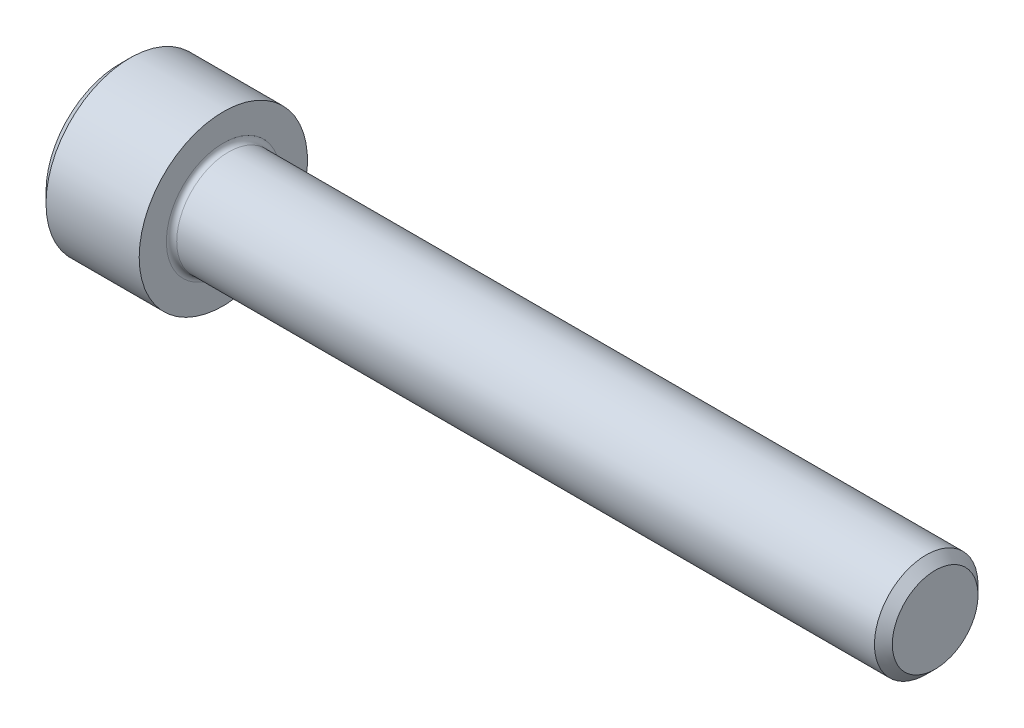
ISO-10303-21;
HEADER;
FILE_DESCRIPTION(('STEP AP214'),'2;1');
FILE_NAME('part.step','',(''),(''),'','','');
FILE_SCHEMA(('AUTOMOTIVE_DESIGN { 1 0 10303 214 1 1 1 1 }'));
ENDSEC;
DATA;
#1=APPLICATION_CONTEXT('core data for automotive mechanical design processes');
#2=APPLICATION_PROTOCOL_DEFINITION('international standard','automotive_design',2000,#1);
#3=PRODUCT_CONTEXT('',#1,'mechanical');
#4=PRODUCT('Part','Part','',(#3));
#5=PRODUCT_RELATED_PRODUCT_CATEGORY('part','',(#4));
#6=PRODUCT_DEFINITION_FORMATION('','',#4);
#7=PRODUCT_DEFINITION_CONTEXT('part definition',#1,'design');
#8=PRODUCT_DEFINITION('design','',#6,#7);
#9=PRODUCT_DEFINITION_SHAPE('','',#8);
#10=(LENGTH_UNIT() NAMED_UNIT(*) SI_UNIT(.MILLI.,.METRE.));
#11=(NAMED_UNIT(*) PLANE_ANGLE_UNIT() SI_UNIT($,.RADIAN.));
#12=(NAMED_UNIT(*) SI_UNIT($,.STERADIAN.) SOLID_ANGLE_UNIT());
#13=UNCERTAINTY_MEASURE_WITH_UNIT(LENGTH_MEASURE(1.E-05),#10,'distance_accuracy_value','');
#14=(GEOMETRIC_REPRESENTATION_CONTEXT(3) GLOBAL_UNCERTAINTY_ASSIGNED_CONTEXT((#13)) GLOBAL_UNIT_ASSIGNED_CONTEXT((#10,
#11,#12)) REPRESENTATION_CONTEXT('',''));
#15=CARTESIAN_POINT('',(0.,0.,0.));
#16=DIRECTION('',(0.,0.,1.));
#17=DIRECTION('',(1.,0.,0.));
#18=AXIS2_PLACEMENT_3D('',#15,#16,#17);
#19=CARTESIAN_POINT('',(0.,0.,0.));
#20=DIRECTION('',(-1.,0.,0.));
#21=DIRECTION('',(0.,0.,1.));
#22=AXIS2_PLACEMENT_3D('',#19,#20,#21);
#23=PLANE('',#22);
#24=DIRECTION('',(0.,-0.5,0.866025403784439));
#25=VECTOR('',#24,1.);
#26=CARTESIAN_POINT('',(0.,3.51894989071077,0.));
#27=LINE('',#26,#25);
#28=CARTESIAN_POINT('',(0.,3.51894989071077,0.));
#29=VERTEX_POINT('',#28);
#30=CARTESIAN_POINT('',(0.,1.75947494535538,3.0475));
#31=VERTEX_POINT('',#30);
#32=EDGE_CURVE('E261',#29,#31,#27,.T.);
#33=ORIENTED_EDGE('',*,*,#32,.T.);
#34=DIRECTION('',(0.,1.,0.));
#35=VECTOR('',#34,1.);
#36=CARTESIAN_POINT('',(0.,-1.75947494535539,3.0475));
#37=LINE('',#36,#35);
#38=CARTESIAN_POINT('',(0.,-1.75947494535539,3.0475));
#39=VERTEX_POINT('',#38);
#40=EDGE_CURVE('E132',#39,#31,#37,.T.);
#41=ORIENTED_EDGE('',*,*,#40,.F.);
#42=DIRECTION('',(0.,-0.500000000000001,-0.866025403784438));
#43=VECTOR('',#42,1.);
#44=CARTESIAN_POINT('',(0.,-1.75947494535539,3.0475));
#45=LINE('',#44,#43);
#46=CARTESIAN_POINT('',(0.,-3.51894989071077,0.));
#47=VERTEX_POINT('',#46);
#48=EDGE_CURVE('E264',#39,#47,#45,.T.);
#49=ORIENTED_EDGE('',*,*,#48,.T.);
#50=DIRECTION('',(0.,0.5,-0.866025403784439));
#51=VECTOR('',#50,1.);
#52=CARTESIAN_POINT('',(0.,-3.51894989071077,0.));
#53=LINE('',#52,#51);
#54=CARTESIAN_POINT('',(0.,-1.75947494535539,-3.0475));
#55=VERTEX_POINT('',#54);
#56=EDGE_CURVE('E267',#47,#55,#53,.T.);
#57=ORIENTED_EDGE('',*,*,#56,.T.);
#58=DIRECTION('',(0.,-1.,0.));
#59=VECTOR('',#58,1.);
#60=CARTESIAN_POINT('',(0.,1.75947494535538,-3.0475));
#61=LINE('',#60,#59);
#62=CARTESIAN_POINT('',(0.,1.75947494535538,-3.0475));
#63=VERTEX_POINT('',#62);
#64=EDGE_CURVE('E270',#63,#55,#61,.T.);
#65=ORIENTED_EDGE('',*,*,#64,.F.);
#66=DIRECTION('',(0.,-0.500000000000001,-0.866025403784438));
#67=VECTOR('',#66,1.);
#68=CARTESIAN_POINT('',(0.,3.51894989071077,0.));
#69=LINE('',#68,#67);
#70=EDGE_CURVE('E127',#29,#63,#69,.T.);
#71=ORIENTED_EDGE('',*,*,#70,.F.);
#72=EDGE_LOOP('',(#33,#41,#49,#57,#65,#71));
#73=FACE_BOUND('',#72,.T.);
#74=CARTESIAN_POINT('',(0.,0.,0.));
#75=DIRECTION('',(-1.,0.,0.));
#76=DIRECTION('',(0.,0.,1.));
#77=AXIS2_PLACEMENT_3D('',#74,#75,#76);
#78=CIRCLE('',#77,5.7);
#79=CARTESIAN_POINT('',(0.,0.,5.7));
#80=VERTEX_POINT('',#79);
#81=EDGE_CURVE('E156',#80,#80,#78,.T.);
#82=ORIENTED_EDGE('',*,*,#81,.T.);
#83=EDGE_LOOP('',(#82));
#84=FACE_BOUND('',#83,.T.);
#85=ADVANCED_FACE('F36',(#73,#84),#23,.T.);
#86=CARTESIAN_POINT('',(0.,0.,0.));
#87=DIRECTION('',(1.,0.,0.));
#88=DIRECTION('',(0.,0.,-1.));
#89=AXIS2_PLACEMENT_3D('',#86,#87,#88);
#90=CONICAL_SURFACE('',#89,5.7,0.785398163397446);
#91=CARTESIAN_POINT('',(0.800000000000002,0.,0.));
#92=DIRECTION('',(-1.,0.,0.));
#93=DIRECTION('',(0.,0.,1.));
#94=AXIS2_PLACEMENT_3D('',#91,#92,#93);
#95=CIRCLE('',#94,6.5);
#96=CARTESIAN_POINT('',(0.800000000000002,0.,6.5));
#97=VERTEX_POINT('',#96);
#98=EDGE_CURVE('E153',#97,#97,#95,.T.);
#99=ORIENTED_EDGE('',*,*,#98,.T.);
#100=EDGE_LOOP('',(#99));
#101=FACE_BOUND('',#100,.T.);
#102=ORIENTED_EDGE('',*,*,#81,.F.);
#103=EDGE_LOOP('',(#102));
#104=FACE_BOUND('',#103,.T.);
#105=ADVANCED_FACE('F177',(#101,#104),#90,.T.);
#106=CARTESIAN_POINT('',(-31.75,0.,0.));
#107=DIRECTION('',(-1.,0.,0.));
#108=DIRECTION('',(0.,0.,1.));
#109=AXIS2_PLACEMENT_3D('',#106,#107,#108);
#110=CYLINDRICAL_SURFACE('',#109,6.5);
#111=CARTESIAN_POINT('',(8.,0.,0.));
#112=DIRECTION('',(-1.,0.,0.));
#113=DIRECTION('',(0.,0.,1.));
#114=AXIS2_PLACEMENT_3D('',#111,#112,#113);
#115=CIRCLE('',#114,6.5);
#116=CARTESIAN_POINT('',(8.,0.,6.5));
#117=VERTEX_POINT('',#116);
#118=EDGE_CURVE('E150',#117,#117,#115,.T.);
#119=ORIENTED_EDGE('',*,*,#118,.T.);
#120=EDGE_LOOP('',(#119));
#121=FACE_BOUND('',#120,.T.);
#122=ORIENTED_EDGE('',*,*,#98,.F.);
#123=EDGE_LOOP('',(#122));
#124=FACE_BOUND('',#123,.T.);
#125=ADVANCED_FACE('F182',(#121,#124),#110,.T.);
#126=CARTESIAN_POINT('',(8.,6.5,0.));
#127=DIRECTION('',(1.,0.,0.));
#128=DIRECTION('',(0.,0.,-1.));
#129=AXIS2_PLACEMENT_3D('',#126,#127,#128);
#130=PLANE('',#129);
#131=CARTESIAN_POINT('',(8.,0.,0.));
#132=DIRECTION('',(1.,0.,0.));
#133=DIRECTION('',(0.,0.,-1.));
#134=AXIS2_PLACEMENT_3D('',#131,#132,#133);
#135=CIRCLE('',#134,4.4);
#136=CARTESIAN_POINT('',(8.,0.,-4.4));
#137=VERTEX_POINT('',#136);
#138=EDGE_CURVE('E44',#137,#137,#135,.F.);
#139=ORIENTED_EDGE('',*,*,#138,.T.);
#140=EDGE_LOOP('',(#139));
#141=FACE_BOUND('',#140,.T.);
#142=ORIENTED_EDGE('',*,*,#118,.F.);
#143=EDGE_LOOP('',(#142));
#144=FACE_BOUND('',#143,.T.);
#145=ADVANCED_FACE('F161',(#141,#144),#130,.T.);
#146=CARTESIAN_POINT('',(-31.75,0.,0.));
#147=DIRECTION('',(-1.,0.,0.));
#148=DIRECTION('',(0.,0.,1.));
#149=AXIS2_PLACEMENT_3D('',#146,#147,#148);
#150=CYLINDRICAL_SURFACE('',#149,4.);
#151=CARTESIAN_POINT('',(8.4,0.,0.));
#152=DIRECTION('',(1.,0.,0.));
#153=DIRECTION('',(0.,0.,-1.));
#154=AXIS2_PLACEMENT_3D('',#151,#152,#153);
#155=CIRCLE('',#154,4.);
#156=CARTESIAN_POINT('',(8.4,0.,-4.));
#157=VERTEX_POINT('',#156);
#158=EDGE_CURVE('E11',#157,#157,#155,.T.);
#159=ORIENTED_EDGE('',*,*,#158,.T.);
#160=EDGE_LOOP('',(#159));
#161=FACE_BOUND('',#160,.T.);
#162=CARTESIAN_POINT('',(62.3095,0.,0.));
#163=DIRECTION('',(-1.,0.,0.));
#164=DIRECTION('',(0.,0.,1.));
#165=AXIS2_PLACEMENT_3D('',#162,#163,#164);
#166=CIRCLE('',#165,4.);
#167=CARTESIAN_POINT('',(62.3095,0.,4.));
#168=VERTEX_POINT('',#167);
#169=EDGE_CURVE('E147',#168,#168,#166,.T.);
#170=ORIENTED_EDGE('',*,*,#169,.T.);
#171=EDGE_LOOP('',(#170));
#172=FACE_BOUND('',#171,.T.);
#173=ADVANCED_FACE('F192',(#161,#172),#150,.T.);
#174=CARTESIAN_POINT('',(63.,0.,0.));
#175=DIRECTION('',(-1.,0.,0.));
#176=DIRECTION('',(0.,0.,1.));
#177=AXIS2_PLACEMENT_3D('',#174,#175,#176);
#178=CONICAL_SURFACE('',#177,3.3095,0.785398163397472);
#179=ORIENTED_EDGE('',*,*,#169,.F.);
#180=EDGE_LOOP('',(#179));
#181=FACE_BOUND('',#180,.T.);
#182=CARTESIAN_POINT('',(63.,0.,0.));
#183=DIRECTION('',(-1.,0.,0.));
#184=DIRECTION('',(0.,0.,1.));
#185=AXIS2_PLACEMENT_3D('',#182,#183,#184);
#186=CIRCLE('',#185,3.3095);
#187=CARTESIAN_POINT('',(63.,0.,3.3095));
#188=VERTEX_POINT('',#187);
#189=EDGE_CURVE('E143',#188,#188,#186,.T.);
#190=ORIENTED_EDGE('',*,*,#189,.T.);
#191=EDGE_LOOP('',(#190));
#192=FACE_BOUND('',#191,.T.);
#193=ADVANCED_FACE('F172',(#181,#192),#178,.T.);
#194=CARTESIAN_POINT('',(63.,3.3095,0.));
#195=DIRECTION('',(1.,0.,0.));
#196=DIRECTION('',(0.,0.,-1.));
#197=AXIS2_PLACEMENT_3D('',#194,#195,#196);
#198=PLANE('',#197);
#199=ORIENTED_EDGE('',*,*,#189,.F.);
#200=EDGE_LOOP('',(#199));
#201=FACE_BOUND('',#200,.T.);
#202=ADVANCED_FACE('F165',(#201),#198,.T.);
#203=CARTESIAN_POINT('',(8.4,0.,0.));
#204=DIRECTION('',(1.,0.,0.));
#205=DIRECTION('',(0.,0.,-1.));
#206=AXIS2_PLACEMENT_3D('',#203,#204,#205);
#207=TOROIDAL_SURFACE('',#206,4.4,0.4);
#208=ORIENTED_EDGE('',*,*,#158,.F.);
#209=EDGE_LOOP('',(#208));
#210=FACE_BOUND('',#209,.T.);
#211=ORIENTED_EDGE('',*,*,#138,.F.);
#212=EDGE_LOOP('',(#211));
#213=FACE_BOUND('',#212,.T.);
#214=ADVANCED_FACE('F38',(#210,#213),#207,.F.);
#215=CARTESIAN_POINT('',(4.,3.51894989071077,0.));
#216=DIRECTION('',(0.,-0.866025403784439,-0.5));
#217=DIRECTION('',(0.,0.5,-0.866025403784439));
#218=AXIS2_PLACEMENT_3D('',#215,#216,#217);
#219=PLANE('',#218);
#220=ORIENTED_EDGE('',*,*,#32,.F.);
#221=DIRECTION('',(-1.,0.,0.));
#222=VECTOR('',#221,1.);
#223=CARTESIAN_POINT('',(4.,3.51894989071077,0.));
#224=LINE('',#223,#222);
#225=CARTESIAN_POINT('',(4.,3.51894989071077,0.));
#226=VERTEX_POINT('',#225);
#227=EDGE_CURVE('E251',#226,#29,#224,.T.);
#228=ORIENTED_EDGE('',*,*,#227,.F.);
#229=DIRECTION('',(0.,-0.5,0.866025403784439));
#230=VECTOR('',#229,1.);
#231=CARTESIAN_POINT('',(4.,3.51894989071077,0.));
#232=LINE('',#231,#230);
#233=CARTESIAN_POINT('',(4.,2.63921241803307,1.52375));
#234=VERTEX_POINT('',#233);
#235=EDGE_CURVE('E119',#226,#234,#232,.T.);
#236=ORIENTED_EDGE('',*,*,#235,.T.);
#237=CARTESIAN_POINT('',(4.,1.75947494535538,3.0475));
#238=VERTEX_POINT('',#237);
#239=EDGE_CURVE('E110',#234,#238,#232,.T.);
#240=ORIENTED_EDGE('',*,*,#239,.T.);
#241=DIRECTION('',(-1.,0.,0.));
#242=VECTOR('',#241,1.);
#243=CARTESIAN_POINT('',(4.,1.75947494535538,3.0475));
#244=LINE('',#243,#242);
#245=EDGE_CURVE('E124',#238,#31,#244,.T.);
#246=ORIENTED_EDGE('',*,*,#245,.T.);
#247=EDGE_LOOP('',(#220,#228,#236,#240,#246));
#248=FACE_BOUND('',#247,.T.);
#249=ADVANCED_FACE('F123',(#248),#219,.T.);
#250=CARTESIAN_POINT('',(4.,-1.75947494535539,3.0475));
#251=DIRECTION('',(0.,0.,1.));
#252=DIRECTION('',(0.,-1.,0.));
#253=AXIS2_PLACEMENT_3D('',#250,#251,#252);
#254=PLANE('',#253);
#255=ORIENTED_EDGE('',*,*,#40,.T.);
#256=ORIENTED_EDGE('',*,*,#245,.F.);
#257=DIRECTION('',(0.,1.,0.));
#258=VECTOR('',#257,1.);
#259=CARTESIAN_POINT('',(4.,-1.75947494535539,3.0475));
#260=LINE('',#259,#258);
#261=CARTESIAN_POINT('',(4.,0.,3.0475));
#262=VERTEX_POINT('',#261);
#263=EDGE_CURVE('E107',#262,#238,#260,.T.);
#264=ORIENTED_EDGE('',*,*,#263,.F.);
#265=CARTESIAN_POINT('',(4.,-1.75947494535539,3.0475));
#266=VERTEX_POINT('',#265);
#267=EDGE_CURVE('E118',#266,#262,#260,.T.);
#268=ORIENTED_EDGE('',*,*,#267,.F.);
#269=DIRECTION('',(-1.,0.,0.));
#270=VECTOR('',#269,1.);
#271=CARTESIAN_POINT('',(4.,-1.75947494535539,3.0475));
#272=LINE('',#271,#270);
#273=EDGE_CURVE('E134',#266,#39,#272,.T.);
#274=ORIENTED_EDGE('',*,*,#273,.T.);
#275=EDGE_LOOP('',(#255,#256,#264,#268,#274));
#276=FACE_BOUND('',#275,.T.);
#277=ADVANCED_FACE('F129',(#276),#254,.F.);
#278=CARTESIAN_POINT('',(4.,-1.75947494535539,3.0475));
#279=DIRECTION('',(0.,0.866025403784438,-0.500000000000001));
#280=DIRECTION('',(0.,0.500000000000001,0.866025403784438));
#281=AXIS2_PLACEMENT_3D('',#278,#279,#280);
#282=PLANE('',#281);
#283=ORIENTED_EDGE('',*,*,#48,.F.);
#284=ORIENTED_EDGE('',*,*,#273,.F.);
#285=DIRECTION('',(0.,-0.500000000000001,-0.866025403784438));
#286=VECTOR('',#285,1.);
#287=CARTESIAN_POINT('',(4.,-1.75947494535539,3.0475));
#288=LINE('',#287,#286);
#289=CARTESIAN_POINT('',(4.,-2.63921241803308,1.52375000000001));
#290=VERTEX_POINT('',#289);
#291=EDGE_CURVE('E290',#266,#290,#288,.T.);
#292=ORIENTED_EDGE('',*,*,#291,.T.);
#293=CARTESIAN_POINT('',(4.,-3.51894989071077,0.));
#294=VERTEX_POINT('',#293);
#295=EDGE_CURVE('E279',#290,#294,#288,.T.);
#296=ORIENTED_EDGE('',*,*,#295,.T.);
#297=DIRECTION('',(-1.,0.,0.));
#298=VECTOR('',#297,1.);
#299=CARTESIAN_POINT('',(4.,-3.51894989071077,0.));
#300=LINE('',#299,#298);
#301=EDGE_CURVE('E139',#294,#47,#300,.T.);
#302=ORIENTED_EDGE('',*,*,#301,.T.);
#303=EDGE_LOOP('',(#283,#284,#292,#296,#302));
#304=FACE_BOUND('',#303,.T.);
#305=ADVANCED_FACE('F205',(#304),#282,.T.);
#306=CARTESIAN_POINT('',(4.,-3.51894989071077,0.));
#307=DIRECTION('',(0.,0.866025403784439,0.5));
#308=DIRECTION('',(0.,-0.5,0.866025403784439));
#309=AXIS2_PLACEMENT_3D('',#306,#307,#308);
#310=PLANE('',#309);
#311=ORIENTED_EDGE('',*,*,#56,.F.);
#312=ORIENTED_EDGE('',*,*,#301,.F.);
#313=DIRECTION('',(0.,0.5,-0.866025403784439));
#314=VECTOR('',#313,1.);
#315=CARTESIAN_POINT('',(4.,-3.51894989071077,0.));
#316=LINE('',#315,#314);
#317=CARTESIAN_POINT('',(4.,-2.63921241803308,-1.52375));
#318=VERTEX_POINT('',#317);
#319=EDGE_CURVE('E257',#294,#318,#316,.T.);
#320=ORIENTED_EDGE('',*,*,#319,.T.);
#321=CARTESIAN_POINT('',(4.,-1.75947494535539,-3.0475));
#322=VERTEX_POINT('',#321);
#323=EDGE_CURVE('E289',#318,#322,#316,.T.);
#324=ORIENTED_EDGE('',*,*,#323,.T.);
#325=DIRECTION('',(-1.,0.,0.));
#326=VECTOR('',#325,1.);
#327=CARTESIAN_POINT('',(4.,-1.75947494535539,-3.0475));
#328=LINE('',#327,#326);
#329=EDGE_CURVE('E250',#322,#55,#328,.T.);
#330=ORIENTED_EDGE('',*,*,#329,.T.);
#331=EDGE_LOOP('',(#311,#312,#320,#324,#330));
#332=FACE_BOUND('',#331,.T.);
#333=ADVANCED_FACE('F208',(#332),#310,.T.);
#334=CARTESIAN_POINT('',(4.,1.75947494535538,-3.0475));
#335=DIRECTION('',(0.,0.,-1.));
#336=DIRECTION('',(0.,1.,0.));
#337=AXIS2_PLACEMENT_3D('',#334,#335,#336);
#338=PLANE('',#337);
#339=ORIENTED_EDGE('',*,*,#64,.T.);
#340=ORIENTED_EDGE('',*,*,#329,.F.);
#341=DIRECTION('',(0.,-1.,0.));
#342=VECTOR('',#341,1.);
#343=CARTESIAN_POINT('',(4.,1.75947494535538,-3.0475));
#344=LINE('',#343,#342);
#345=CARTESIAN_POINT('',(4.,0.,-3.0475));
#346=VERTEX_POINT('',#345);
#347=EDGE_CURVE('E254',#346,#322,#344,.T.);
#348=ORIENTED_EDGE('',*,*,#347,.F.);
#349=CARTESIAN_POINT('',(4.,1.75947494535538,-3.0475));
#350=VERTEX_POINT('',#349);
#351=EDGE_CURVE('E51',#350,#346,#344,.T.);
#352=ORIENTED_EDGE('',*,*,#351,.F.);
#353=DIRECTION('',(-1.,0.,0.));
#354=VECTOR('',#353,1.);
#355=CARTESIAN_POINT('',(4.,1.75947494535538,-3.0475));
#356=LINE('',#355,#354);
#357=EDGE_CURVE('E247',#350,#63,#356,.T.);
#358=ORIENTED_EDGE('',*,*,#357,.T.);
#359=EDGE_LOOP('',(#339,#340,#348,#352,#358));
#360=FACE_BOUND('',#359,.T.);
#361=ADVANCED_FACE('F212',(#360),#338,.F.);
#362=CARTESIAN_POINT('',(4.,3.51894989071077,0.));
#363=DIRECTION('',(0.,0.866025403784438,-0.500000000000001));
#364=DIRECTION('',(0.,0.500000000000001,0.866025403784438));
#365=AXIS2_PLACEMENT_3D('',#362,#363,#364);
#366=PLANE('',#365);
#367=ORIENTED_EDGE('',*,*,#70,.T.);
#368=ORIENTED_EDGE('',*,*,#357,.F.);
#369=DIRECTION('',(0.,-0.500000000000001,-0.866025403784438));
#370=VECTOR('',#369,1.);
#371=CARTESIAN_POINT('',(4.,3.51894989071077,0.));
#372=LINE('',#371,#370);
#373=CARTESIAN_POINT('',(4.,2.63921241803307,-1.52375));
#374=VERTEX_POINT('',#373);
#375=EDGE_CURVE('E237',#374,#350,#372,.T.);
#376=ORIENTED_EDGE('',*,*,#375,.F.);
#377=EDGE_CURVE('E243',#226,#374,#372,.T.);
#378=ORIENTED_EDGE('',*,*,#377,.F.);
#379=ORIENTED_EDGE('',*,*,#227,.T.);
#380=EDGE_LOOP('',(#367,#368,#376,#378,#379));
#381=FACE_BOUND('',#380,.T.);
#382=ADVANCED_FACE('F216',(#381),#366,.F.);
#383=CARTESIAN_POINT('',(4.,3.51894989071077,0.));
#384=DIRECTION('',(1.,0.,0.));
#385=DIRECTION('',(0.,0.,-1.));
#386=AXIS2_PLACEMENT_3D('',#383,#384,#385);
#387=PLANE('',#386);
#388=ORIENTED_EDGE('',*,*,#347,.T.);
#389=ORIENTED_EDGE('',*,*,#323,.F.);
#390=CARTESIAN_POINT('',(4.,0.,0.));
#391=DIRECTION('',(-1.,0.,0.));
#392=DIRECTION('',(0.,0.,1.));
#393=AXIS2_PLACEMENT_3D('',#390,#391,#392);
#394=CIRCLE('',#393,3.0475);
#395=EDGE_CURVE('E285',#346,#318,#394,.T.);
#396=ORIENTED_EDGE('',*,*,#395,.F.);
#397=EDGE_LOOP('',(#388,#389,#396));
#398=FACE_BOUND('',#397,.T.);
#399=ADVANCED_FACE('F220',(#398),#387,.F.);
#400=ORIENTED_EDGE('',*,*,#319,.F.);
#401=ORIENTED_EDGE('',*,*,#295,.F.);
#402=EDGE_CURVE('E137',#318,#290,#394,.T.);
#403=ORIENTED_EDGE('',*,*,#402,.F.);
#404=EDGE_LOOP('',(#400,#401,#403));
#405=FACE_BOUND('',#404,.T.);
#406=ADVANCED_FACE('F223',(#405),#387,.F.);
#407=ORIENTED_EDGE('',*,*,#291,.F.);
#408=ORIENTED_EDGE('',*,*,#267,.T.);
#409=EDGE_CURVE('E133',#290,#262,#394,.T.);
#410=ORIENTED_EDGE('',*,*,#409,.F.);
#411=EDGE_LOOP('',(#407,#408,#410));
#412=FACE_BOUND('',#411,.T.);
#413=ADVANCED_FACE('F228',(#412),#387,.F.);
#414=ORIENTED_EDGE('',*,*,#263,.T.);
#415=ORIENTED_EDGE('',*,*,#239,.F.);
#416=EDGE_CURVE('E113',#262,#234,#394,.T.);
#417=ORIENTED_EDGE('',*,*,#416,.F.);
#418=EDGE_LOOP('',(#414,#415,#417));
#419=FACE_BOUND('',#418,.T.);
#420=ADVANCED_FACE('F109',(#419),#387,.F.);
#421=ORIENTED_EDGE('',*,*,#235,.F.);
#422=ORIENTED_EDGE('',*,*,#377,.T.);
#423=EDGE_CURVE('E144',#234,#374,#394,.T.);
#424=ORIENTED_EDGE('',*,*,#423,.F.);
#425=EDGE_LOOP('',(#421,#422,#424));
#426=FACE_BOUND('',#425,.T.);
#427=ADVANCED_FACE('F231',(#426),#387,.F.);
#428=ORIENTED_EDGE('',*,*,#375,.T.);
#429=ORIENTED_EDGE('',*,*,#351,.T.);
#430=EDGE_CURVE('E240',#374,#346,#394,.T.);
#431=ORIENTED_EDGE('',*,*,#430,.F.);
#432=EDGE_LOOP('',(#428,#429,#431));
#433=FACE_BOUND('',#432,.T.);
#434=ADVANCED_FACE('F201',(#433),#387,.F.);
#435=CARTESIAN_POINT('',(4.,0.,0.));
#436=DIRECTION('',(-1.,0.,0.));
#437=DIRECTION('',(0.,0.,1.));
#438=AXIS2_PLACEMENT_3D('',#435,#436,#437);
#439=CONICAL_SURFACE('',#438,3.0475,1.04719755119659);
#440=CARTESIAN_POINT('',(5.75947494535541,0.,0.));
#441=VERTEX_POINT('',#440);
#442=VERTEX_LOOP('',#441);
#443=FACE_BOUND('',#442,.T.);
#444=ORIENTED_EDGE('',*,*,#416,.T.);
#445=ORIENTED_EDGE('',*,*,#423,.T.);
#446=ORIENTED_EDGE('',*,*,#430,.T.);
#447=ORIENTED_EDGE('',*,*,#395,.T.);
#448=ORIENTED_EDGE('',*,*,#402,.T.);
#449=ORIENTED_EDGE('',*,*,#409,.T.);
#450=EDGE_LOOP('',(#444,#445,#446,#447,#448,#449));
#451=FACE_BOUND('',#450,.T.);
#452=ADVANCED_FACE('F199',(#443,#451),#439,.F.);
#453=CLOSED_SHELL('',(#85,#105,#125,#145,#173,#193,#202,#214,#249,#277,#305,#333,#361,#382,#399,
#406,#413,#420,#427,#434,#452));
#454=MANIFOLD_SOLID_BREP('B2',#453);
#455=ADVANCED_BREP_SHAPE_REPRESENTATION('',(#18,#454),#14);
#456=SHAPE_DEFINITION_REPRESENTATION(#9,#455);
ENDSEC;
END-ISO-10303-21;
